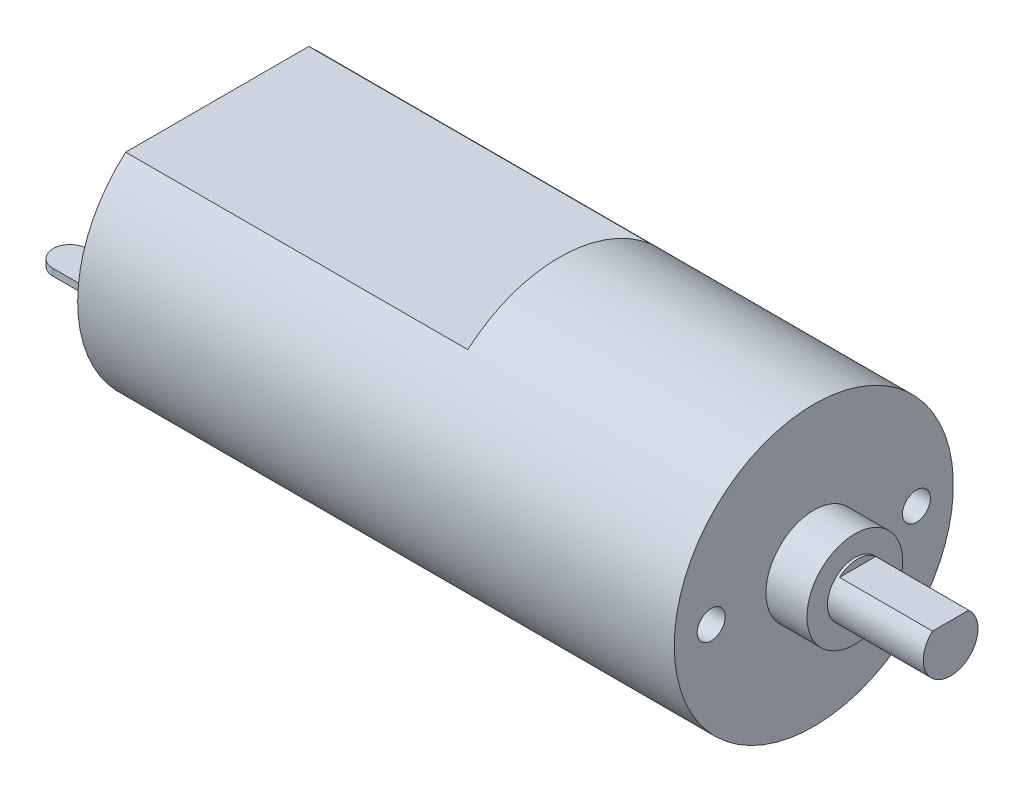
ISO-10303-21;
HEADER;
FILE_DESCRIPTION(('STEP AP214'),'2;1');
FILE_NAME('part.step','',(''),(''),'','','');
FILE_SCHEMA(('AUTOMOTIVE_DESIGN { 1 0 10303 214 1 1 1 1 }'));
ENDSEC;
DATA;
#1=APPLICATION_CONTEXT('core data for automotive mechanical design processes');
#2=APPLICATION_PROTOCOL_DEFINITION('international standard','automotive_design',2000,#1);
#3=PRODUCT_CONTEXT('',#1,'mechanical');
#4=PRODUCT('Part','Part','',(#3));
#5=PRODUCT_RELATED_PRODUCT_CATEGORY('part','',(#4));
#6=PRODUCT_DEFINITION_FORMATION('','',#4);
#7=PRODUCT_DEFINITION_CONTEXT('part definition',#1,'design');
#8=PRODUCT_DEFINITION('design','',#6,#7);
#9=PRODUCT_DEFINITION_SHAPE('','',#8);
#10=(LENGTH_UNIT() NAMED_UNIT(*) SI_UNIT(.MILLI.,.METRE.));
#11=(NAMED_UNIT(*) PLANE_ANGLE_UNIT() SI_UNIT($,.RADIAN.));
#12=(NAMED_UNIT(*) SI_UNIT($,.STERADIAN.) SOLID_ANGLE_UNIT());
#13=UNCERTAINTY_MEASURE_WITH_UNIT(LENGTH_MEASURE(1.E-05),#10,'distance_accuracy_value','');
#14=(GEOMETRIC_REPRESENTATION_CONTEXT(3) GLOBAL_UNCERTAINTY_ASSIGNED_CONTEXT((#13)) GLOBAL_UNIT_ASSIGNED_CONTEXT((#10,
#11,#12)) REPRESENTATION_CONTEXT('',''));
#15=CARTESIAN_POINT('',(0.,0.,0.));
#16=DIRECTION('',(0.,0.,1.));
#17=DIRECTION('',(1.,0.,0.));
#18=AXIS2_PLACEMENT_3D('',#15,#16,#17);
#19=CARTESIAN_POINT('',(-26.8,10.2,0.));
#20=DIRECTION('',(1.,0.,0.));
#21=DIRECTION('',(0.,0.,-1.));
#22=AXIS2_PLACEMENT_3D('',#19,#20,#21);
#23=PLANE('',#22);
#24=CARTESIAN_POINT('',(-26.8,0.,0.));
#25=DIRECTION('',(1.,0.,0.));
#26=DIRECTION('',(0.,0.,-1.));
#27=AXIS2_PLACEMENT_3D('',#24,#25,#26);
#28=CIRCLE('',#27,3.);
#29=CARTESIAN_POINT('',(-26.8,0.,-3.));
#30=VERTEX_POINT('',#29);
#31=EDGE_CURVE('E11',#30,#30,#28,.F.);
#32=ORIENTED_EDGE('',*,*,#31,.F.);
#33=EDGE_LOOP('',(#32));
#34=FACE_BOUND('',#33,.T.);
#35=CARTESIAN_POINT('',(-26.8,0.,0.));
#36=DIRECTION('',(-1.,0.,0.));
#37=DIRECTION('',(0.,0.,1.));
#38=AXIS2_PLACEMENT_3D('',#35,#36,#37);
#39=CIRCLE('',#38,10.2);
#40=CARTESIAN_POINT('',(-26.8,-7.7,6.68954408012981));
#41=VERTEX_POINT('',#40);
#42=CARTESIAN_POINT('',(-26.8,7.7,6.68954408012982));
#43=VERTEX_POINT('',#42);
#44=EDGE_CURVE('E290',#41,#43,#39,.T.);
#45=ORIENTED_EDGE('',*,*,#44,.T.);
#46=DIRECTION('',(0.,0.,1.));
#47=VECTOR('',#46,1.);
#48=CARTESIAN_POINT('',(-26.8,7.7,-6.68954408012982));
#49=LINE('',#48,#47);
#50=CARTESIAN_POINT('',(-26.8,7.7,-6.68954408012982));
#51=VERTEX_POINT('',#50);
#52=EDGE_CURVE('E247',#51,#43,#49,.T.);
#53=ORIENTED_EDGE('',*,*,#52,.F.);
#54=CARTESIAN_POINT('',(-26.8,-7.7,-6.68954408012982));
#55=VERTEX_POINT('',#54);
#56=EDGE_CURVE('E296',#51,#55,#39,.T.);
#57=ORIENTED_EDGE('',*,*,#56,.T.);
#58=DIRECTION('',(0.,0.,-1.));
#59=VECTOR('',#58,1.);
#60=CARTESIAN_POINT('',(-26.8,-7.7,-6.68954408012982));
#61=LINE('',#60,#59);
#62=EDGE_CURVE('E242',#41,#55,#61,.T.);
#63=ORIENTED_EDGE('',*,*,#62,.F.);
#64=EDGE_LOOP('',(#45,#53,#57,#63));
#65=FACE_BOUND('',#64,.T.);
#66=DIRECTION('',(0.,-1.,0.));
#67=VECTOR('',#66,1.);
#68=CARTESIAN_POINT('',(-26.8,0.25,-9.25));
#69=LINE('',#68,#67);
#70=CARTESIAN_POINT('',(-26.8,0.25,-9.25));
#71=VERTEX_POINT('',#70);
#72=CARTESIAN_POINT('',(-26.8,-0.25,-9.25));
#73=VERTEX_POINT('',#72);
#74=EDGE_CURVE('E69',#71,#73,#69,.T.);
#75=ORIENTED_EDGE('',*,*,#74,.F.);
#76=DIRECTION('',(0.,0.,-1.));
#77=VECTOR('',#76,1.);
#78=CARTESIAN_POINT('',(-26.8,0.25,-6.75));
#79=LINE('',#78,#77);
#80=CARTESIAN_POINT('',(-26.8,0.25,-6.75));
#81=VERTEX_POINT('',#80);
#82=EDGE_CURVE('E190',#81,#71,#79,.T.);
#83=ORIENTED_EDGE('',*,*,#82,.F.);
#84=DIRECTION('',(0.,-1.,0.));
#85=VECTOR('',#84,1.);
#86=CARTESIAN_POINT('',(-26.8,0.25,-6.75));
#87=LINE('',#86,#85);
#88=CARTESIAN_POINT('',(-26.8,-0.25,-6.75));
#89=VERTEX_POINT('',#88);
#90=EDGE_CURVE('E204',#81,#89,#87,.T.);
#91=ORIENTED_EDGE('',*,*,#90,.T.);
#92=DIRECTION('',(0.,0.,-1.));
#93=VECTOR('',#92,1.);
#94=CARTESIAN_POINT('',(-26.8,-0.25,-6.75));
#95=LINE('',#94,#93);
#96=EDGE_CURVE('E180',#89,#73,#95,.T.);
#97=ORIENTED_EDGE('',*,*,#96,.T.);
#98=EDGE_LOOP('',(#75,#83,#91,#97));
#99=FACE_BOUND('',#98,.T.);
#100=DIRECTION('',(0.,0.,-1.));
#101=VECTOR('',#100,1.);
#102=CARTESIAN_POINT('',(-26.8,0.25,6.75));
#103=LINE('',#102,#101);
#104=CARTESIAN_POINT('',(-26.8,0.25,9.25));
#105=VERTEX_POINT('',#104);
#106=CARTESIAN_POINT('',(-26.8,0.25,6.75));
#107=VERTEX_POINT('',#106);
#108=EDGE_CURVE('E165',#105,#107,#103,.T.);
#109=ORIENTED_EDGE('',*,*,#108,.F.);
#110=DIRECTION('',(0.,-1.,0.));
#111=VECTOR('',#110,1.);
#112=CARTESIAN_POINT('',(-26.8,0.25,9.25));
#113=LINE('',#112,#111);
#114=CARTESIAN_POINT('',(-26.8,-0.25,9.25));
#115=VERTEX_POINT('',#114);
#116=EDGE_CURVE('E161',#105,#115,#113,.T.);
#117=ORIENTED_EDGE('',*,*,#116,.T.);
#118=DIRECTION('',(0.,0.,-1.));
#119=VECTOR('',#118,1.);
#120=CARTESIAN_POINT('',(-26.8,-0.25,6.75));
#121=LINE('',#120,#119);
#122=CARTESIAN_POINT('',(-26.8,-0.25,6.75));
#123=VERTEX_POINT('',#122);
#124=EDGE_CURVE('E603',#115,#123,#121,.T.);
#125=ORIENTED_EDGE('',*,*,#124,.T.);
#126=DIRECTION('',(0.,-1.,0.));
#127=VECTOR('',#126,1.);
#128=CARTESIAN_POINT('',(-26.8,0.25,6.75));
#129=LINE('',#128,#127);
#130=EDGE_CURVE('E186',#107,#123,#129,.T.);
#131=ORIENTED_EDGE('',*,*,#130,.F.);
#132=EDGE_LOOP('',(#109,#117,#125,#131));
#133=FACE_BOUND('',#132,.T.);
#134=ADVANCED_FACE('F45',(#34,#65,#99,#133),#23,.F.);
#135=CARTESIAN_POINT('',(26.8,0.,0.));
#136=DIRECTION('',(-1.,0.,0.));
#137=DIRECTION('',(0.,0.,1.));
#138=AXIS2_PLACEMENT_3D('',#135,#136,#137);
#139=PLANE('',#138);
#140=CARTESIAN_POINT('',(26.8,0.,0.));
#141=DIRECTION('',(-1.,0.,0.));
#142=DIRECTION('',(0.,0.,1.));
#143=AXIS2_PLACEMENT_3D('',#140,#141,#142);
#144=CIRCLE('',#143,2.);
#145=CARTESIAN_POINT('',(26.8,1.5,-1.32287565553229));
#146=VERTEX_POINT('',#145);
#147=CARTESIAN_POINT('',(26.8,1.5,1.32287565553229));
#148=VERTEX_POINT('',#147);
#149=EDGE_CURVE('E54',#146,#148,#144,.T.);
#150=ORIENTED_EDGE('',*,*,#149,.F.);
#151=DIRECTION('',(0.,0.,-1.));
#152=VECTOR('',#151,1.);
#153=CARTESIAN_POINT('',(26.8,1.5,1.32287565553229));
#154=LINE('',#153,#152);
#155=EDGE_CURVE('E259',#148,#146,#154,.T.);
#156=ORIENTED_EDGE('',*,*,#155,.F.);
#157=EDGE_LOOP('',(#150,#156));
#158=FACE_BOUND('',#157,.T.);
#159=ADVANCED_FACE('F47',(#158),#139,.F.);
#160=CARTESIAN_POINT('',(-26.8,0.,0.));
#161=DIRECTION('',(-1.,0.,0.));
#162=DIRECTION('',(0.,0.,1.));
#163=AXIS2_PLACEMENT_3D('',#160,#161,#162);
#164=CYLINDRICAL_SURFACE('',#163,2.);
#165=ORIENTED_EDGE('',*,*,#149,.T.);
#166=DIRECTION('',(1.,0.,0.));
#167=VECTOR('',#166,1.);
#168=CARTESIAN_POINT('',(20.,1.5,1.32287565553229));
#169=LINE('',#168,#167);
#170=CARTESIAN_POINT('',(20.,1.5,1.32287565553229));
#171=VERTEX_POINT('',#170);
#172=EDGE_CURVE('E283',#171,#148,#169,.T.);
#173=ORIENTED_EDGE('',*,*,#172,.F.);
#174=CARTESIAN_POINT('',(20.,0.,0.));
#175=DIRECTION('',(1.,0.,0.));
#176=DIRECTION('',(0.,0.,-1.));
#177=AXIS2_PLACEMENT_3D('',#174,#175,#176);
#178=CIRCLE('',#177,2.);
#179=CARTESIAN_POINT('',(20.,1.5,-1.32287565553229));
#180=VERTEX_POINT('',#179);
#181=EDGE_CURVE('E277',#180,#171,#178,.T.);
#182=ORIENTED_EDGE('',*,*,#181,.F.);
#183=DIRECTION('',(1.,0.,0.));
#184=VECTOR('',#183,1.);
#185=CARTESIAN_POINT('',(20.,1.5,-1.32287565553229));
#186=LINE('',#185,#184);
#187=EDGE_CURVE('E286',#180,#146,#186,.T.);
#188=ORIENTED_EDGE('',*,*,#187,.T.);
#189=EDGE_LOOP('',(#165,#173,#182,#188));
#190=FACE_BOUND('',#189,.T.);
#191=CARTESIAN_POINT('',(19.8,0.,0.));
#192=DIRECTION('',(-1.,0.,0.));
#193=DIRECTION('',(0.,0.,1.));
#194=AXIS2_PLACEMENT_3D('',#191,#192,#193);
#195=CIRCLE('',#194,2.);
#196=CARTESIAN_POINT('',(19.8,0.,2.));
#197=VERTEX_POINT('',#196);
#198=EDGE_CURVE('E309',#197,#197,#195,.T.);
#199=ORIENTED_EDGE('',*,*,#198,.F.);
#200=EDGE_LOOP('',(#199));
#201=FACE_BOUND('',#200,.T.);
#202=ADVANCED_FACE('F317',(#190,#201),#164,.T.);
#203=CARTESIAN_POINT('',(19.8,2.,0.));
#204=DIRECTION('',(-1.,0.,0.));
#205=DIRECTION('',(0.,0.,1.));
#206=AXIS2_PLACEMENT_3D('',#203,#204,#205);
#207=PLANE('',#206);
#208=CARTESIAN_POINT('',(19.8,0.,0.));
#209=DIRECTION('',(-1.,0.,0.));
#210=DIRECTION('',(0.,0.,1.));
#211=AXIS2_PLACEMENT_3D('',#208,#209,#210);
#212=CIRCLE('',#211,3.5);
#213=CARTESIAN_POINT('',(19.8,0.,3.5));
#214=VERTEX_POINT('',#213);
#215=EDGE_CURVE('E305',#214,#214,#212,.T.);
#216=ORIENTED_EDGE('',*,*,#215,.F.);
#217=EDGE_LOOP('',(#216));
#218=FACE_BOUND('',#217,.T.);
#219=ORIENTED_EDGE('',*,*,#198,.T.);
#220=EDGE_LOOP('',(#219));
#221=FACE_BOUND('',#220,.T.);
#222=ADVANCED_FACE('F361',(#218,#221),#207,.F.);
#223=CARTESIAN_POINT('',(-26.8,0.,0.));
#224=DIRECTION('',(-1.,0.,0.));
#225=DIRECTION('',(0.,0.,1.));
#226=AXIS2_PLACEMENT_3D('',#223,#224,#225);
#227=CYLINDRICAL_SURFACE('',#226,3.5);
#228=CARTESIAN_POINT('',(16.8,0.,0.));
#229=DIRECTION('',(-1.,0.,0.));
#230=DIRECTION('',(0.,0.,1.));
#231=AXIS2_PLACEMENT_3D('',#228,#229,#230);
#232=CIRCLE('',#231,3.5);
#233=CARTESIAN_POINT('',(16.8,0.,3.5));
#234=VERTEX_POINT('',#233);
#235=EDGE_CURVE('E301',#234,#234,#232,.T.);
#236=ORIENTED_EDGE('',*,*,#235,.F.);
#237=EDGE_LOOP('',(#236));
#238=FACE_BOUND('',#237,.T.);
#239=ORIENTED_EDGE('',*,*,#215,.T.);
#240=EDGE_LOOP('',(#239));
#241=FACE_BOUND('',#240,.T.);
#242=ADVANCED_FACE('F357',(#238,#241),#227,.T.);
#243=CARTESIAN_POINT('',(16.8,3.5,0.));
#244=DIRECTION('',(-1.,0.,0.));
#245=DIRECTION('',(0.,0.,1.));
#246=AXIS2_PLACEMENT_3D('',#243,#244,#245);
#247=PLANE('',#246);
#248=CARTESIAN_POINT('',(16.8,0.,7.5));
#249=DIRECTION('',(1.,0.,0.));
#250=DIRECTION('',(0.,0.,-1.));
#251=AXIS2_PLACEMENT_3D('',#248,#249,#250);
#252=CIRCLE('',#251,1.02499999999999);
#253=CARTESIAN_POINT('',(16.8,0.,6.47500000000001));
#254=VERTEX_POINT('',#253);
#255=EDGE_CURVE('E226',#254,#254,#252,.T.);
#256=ORIENTED_EDGE('',*,*,#255,.F.);
#257=EDGE_LOOP('',(#256));
#258=FACE_BOUND('',#257,.T.);
#259=CARTESIAN_POINT('',(16.8,0.,-7.5));
#260=DIRECTION('',(1.,0.,0.));
#261=DIRECTION('',(0.,0.,-1.));
#262=AXIS2_PLACEMENT_3D('',#259,#260,#261);
#263=CIRCLE('',#262,1.02499999999999);
#264=CARTESIAN_POINT('',(16.8,0.,-8.52499999999999));
#265=VERTEX_POINT('',#264);
#266=EDGE_CURVE('E234',#265,#265,#263,.T.);
#267=ORIENTED_EDGE('',*,*,#266,.F.);
#268=EDGE_LOOP('',(#267));
#269=FACE_BOUND('',#268,.T.);
#270=CARTESIAN_POINT('',(16.8,0.,0.));
#271=DIRECTION('',(-1.,0.,0.));
#272=DIRECTION('',(0.,0.,1.));
#273=AXIS2_PLACEMENT_3D('',#270,#271,#272);
#274=CIRCLE('',#273,10.2);
#275=CARTESIAN_POINT('',(16.8,0.,10.2));
#276=VERTEX_POINT('',#275);
#277=EDGE_CURVE('E297',#276,#276,#274,.T.);
#278=ORIENTED_EDGE('',*,*,#277,.F.);
#279=EDGE_LOOP('',(#278));
#280=FACE_BOUND('',#279,.T.);
#281=ORIENTED_EDGE('',*,*,#235,.T.);
#282=EDGE_LOOP('',(#281));
#283=FACE_BOUND('',#282,.T.);
#284=ADVANCED_FACE('F353',(#258,#269,#280,#283),#247,.F.);
#285=CARTESIAN_POINT('',(-26.8,0.,0.));
#286=DIRECTION('',(-1.,0.,0.));
#287=DIRECTION('',(0.,0.,1.));
#288=AXIS2_PLACEMENT_3D('',#285,#286,#287);
#289=CYLINDRICAL_SURFACE('',#288,10.2);
#290=CARTESIAN_POINT('',(-1.8,0.,0.));
#291=DIRECTION('',(-1.,0.,0.));
#292=DIRECTION('',(0.,0.,1.));
#293=AXIS2_PLACEMENT_3D('',#290,#291,#292);
#294=CIRCLE('',#293,10.2);
#295=CARTESIAN_POINT('',(-1.8,7.7,6.68954408012982));
#296=VERTEX_POINT('',#295);
#297=CARTESIAN_POINT('',(-1.8,7.7,-6.68954408012982));
#298=VERTEX_POINT('',#297);
#299=EDGE_CURVE('E243',#296,#298,#294,.T.);
#300=ORIENTED_EDGE('',*,*,#299,.F.);
#301=DIRECTION('',(-1.,0.,0.));
#302=VECTOR('',#301,1.);
#303=CARTESIAN_POINT('',(-1.8,7.7,6.68954408012982));
#304=LINE('',#303,#302);
#305=EDGE_CURVE('E255',#296,#43,#304,.T.);
#306=ORIENTED_EDGE('',*,*,#305,.T.);
#307=ORIENTED_EDGE('',*,*,#44,.F.);
#308=DIRECTION('',(-1.,0.,0.));
#309=VECTOR('',#308,1.);
#310=CARTESIAN_POINT('',(-1.8,-7.7,6.68954408012982));
#311=LINE('',#310,#309);
#312=CARTESIAN_POINT('',(-1.8,-7.7,6.68954408012982));
#313=VERTEX_POINT('',#312);
#314=EDGE_CURVE('E269',#313,#41,#311,.T.);
#315=ORIENTED_EDGE('',*,*,#314,.F.);
#316=CARTESIAN_POINT('',(-1.8,0.,0.));
#317=DIRECTION('',(-1.,0.,0.));
#318=DIRECTION('',(0.,0.,1.));
#319=AXIS2_PLACEMENT_3D('',#316,#317,#318);
#320=CIRCLE('',#319,10.2);
#321=CARTESIAN_POINT('',(-1.8,-7.7,-6.68954408012982));
#322=VERTEX_POINT('',#321);
#323=EDGE_CURVE('E262',#322,#313,#320,.T.);
#324=ORIENTED_EDGE('',*,*,#323,.F.);
#325=DIRECTION('',(-1.,0.,0.));
#326=VECTOR('',#325,1.);
#327=CARTESIAN_POINT('',(-1.8,-7.7,-6.68954408012982));
#328=LINE('',#327,#326);
#329=EDGE_CURVE('E254',#322,#55,#328,.T.);
#330=ORIENTED_EDGE('',*,*,#329,.T.);
#331=ORIENTED_EDGE('',*,*,#56,.F.);
#332=DIRECTION('',(-1.,0.,0.));
#333=VECTOR('',#332,1.);
#334=CARTESIAN_POINT('',(-1.8,7.7,-6.68954408012982));
#335=LINE('',#334,#333);
#336=EDGE_CURVE('E251',#298,#51,#335,.T.);
#337=ORIENTED_EDGE('',*,*,#336,.F.);
#338=EDGE_LOOP('',(#300,#306,#307,#315,#324,#330,#331,#337));
#339=FACE_BOUND('',#338,.T.);
#340=ORIENTED_EDGE('',*,*,#277,.T.);
#341=EDGE_LOOP('',(#340));
#342=FACE_BOUND('',#341,.T.);
#343=ADVANCED_FACE('F338',(#339,#342),#289,.T.);
#344=CARTESIAN_POINT('',(20.,1.5,1.32287565553229));
#345=DIRECTION('',(0.,-1.,0.));
#346=DIRECTION('',(0.,0.,-1.));
#347=AXIS2_PLACEMENT_3D('',#344,#345,#346);
#348=PLANE('',#347);
#349=ORIENTED_EDGE('',*,*,#155,.T.);
#350=ORIENTED_EDGE('',*,*,#187,.F.);
#351=DIRECTION('',(0.,0.,-1.));
#352=VECTOR('',#351,1.);
#353=CARTESIAN_POINT('',(20.,1.5,1.32287565553229));
#354=LINE('',#353,#352);
#355=EDGE_CURVE('E280',#171,#180,#354,.T.);
#356=ORIENTED_EDGE('',*,*,#355,.F.);
#357=ORIENTED_EDGE('',*,*,#172,.T.);
#358=EDGE_LOOP('',(#349,#350,#356,#357));
#359=FACE_BOUND('',#358,.T.);
#360=ADVANCED_FACE('F324',(#359),#348,.F.);
#361=CARTESIAN_POINT('',(20.,0.,0.));
#362=DIRECTION('',(1.,0.,0.));
#363=DIRECTION('',(0.,0.,-1.));
#364=AXIS2_PLACEMENT_3D('',#361,#362,#363);
#365=PLANE('',#364);
#366=ORIENTED_EDGE('',*,*,#181,.T.);
#367=ORIENTED_EDGE('',*,*,#355,.T.);
#368=EDGE_LOOP('',(#366,#367));
#369=FACE_BOUND('',#368,.T.);
#370=ADVANCED_FACE('F327',(#369),#365,.T.);
#371=CARTESIAN_POINT('',(-1.8,-7.7,-6.68954408012982));
#372=DIRECTION('',(0.,1.,0.));
#373=DIRECTION('',(0.,0.,1.));
#374=AXIS2_PLACEMENT_3D('',#371,#372,#373);
#375=PLANE('',#374);
#376=ORIENTED_EDGE('',*,*,#62,.T.);
#377=ORIENTED_EDGE('',*,*,#329,.F.);
#378=DIRECTION('',(0.,0.,-1.));
#379=VECTOR('',#378,1.);
#380=CARTESIAN_POINT('',(-1.8,-7.7,-6.68954408012982));
#381=LINE('',#380,#379);
#382=EDGE_CURVE('E265',#313,#322,#381,.T.);
#383=ORIENTED_EDGE('',*,*,#382,.F.);
#384=ORIENTED_EDGE('',*,*,#314,.T.);
#385=EDGE_LOOP('',(#376,#377,#383,#384));
#386=FACE_BOUND('',#385,.T.);
#387=ADVANCED_FACE('F329',(#386),#375,.F.);
#388=CARTESIAN_POINT('',(-1.8,0.,0.));
#389=DIRECTION('',(-1.,0.,0.));
#390=DIRECTION('',(0.,0.,1.));
#391=AXIS2_PLACEMENT_3D('',#388,#389,#390);
#392=PLANE('',#391);
#393=ORIENTED_EDGE('',*,*,#323,.T.);
#394=ORIENTED_EDGE('',*,*,#382,.T.);
#395=EDGE_LOOP('',(#393,#394));
#396=FACE_BOUND('',#395,.T.);
#397=ADVANCED_FACE('F335',(#396),#392,.T.);
#398=CARTESIAN_POINT('',(-1.8,7.7,-6.68954408012982));
#399=DIRECTION('',(0.,-1.,0.));
#400=DIRECTION('',(0.,0.,-1.));
#401=AXIS2_PLACEMENT_3D('',#398,#399,#400);
#402=PLANE('',#401);
#403=ORIENTED_EDGE('',*,*,#52,.T.);
#404=ORIENTED_EDGE('',*,*,#305,.F.);
#405=DIRECTION('',(0.,0.,1.));
#406=VECTOR('',#405,1.);
#407=CARTESIAN_POINT('',(-1.8,7.7,-6.68954408012982));
#408=LINE('',#407,#406);
#409=EDGE_CURVE('E246',#298,#296,#408,.T.);
#410=ORIENTED_EDGE('',*,*,#409,.F.);
#411=ORIENTED_EDGE('',*,*,#336,.T.);
#412=EDGE_LOOP('',(#403,#404,#410,#411));
#413=FACE_BOUND('',#412,.T.);
#414=ADVANCED_FACE('F415',(#413),#402,.F.);
#415=CARTESIAN_POINT('',(-1.8,0.,0.));
#416=DIRECTION('',(-1.,0.,0.));
#417=DIRECTION('',(0.,0.,1.));
#418=AXIS2_PLACEMENT_3D('',#415,#416,#417);
#419=PLANE('',#418);
#420=ORIENTED_EDGE('',*,*,#299,.T.);
#421=ORIENTED_EDGE('',*,*,#409,.T.);
#422=EDGE_LOOP('',(#420,#421));
#423=FACE_BOUND('',#422,.T.);
#424=ADVANCED_FACE('F424',(#423),#419,.T.);
#425=CARTESIAN_POINT('',(10.45,0.,-7.5));
#426=DIRECTION('',(1.,0.,0.));
#427=DIRECTION('',(0.,0.,-1.));
#428=AXIS2_PLACEMENT_3D('',#425,#426,#427);
#429=CONICAL_SURFACE('',#428,1.02499999999999,1.02974425867665);
#430=CARTESIAN_POINT('',(9.83411786549675,0.,-7.5));
#431=VERTEX_POINT('',#430);
#432=VERTEX_LOOP('',#431);
#433=FACE_BOUND('',#432,.T.);
#434=CARTESIAN_POINT('',(10.45,0.,-7.5));
#435=DIRECTION('',(1.,0.,0.));
#436=DIRECTION('',(0.,0.,-1.));
#437=AXIS2_PLACEMENT_3D('',#434,#435,#436);
#438=CIRCLE('',#437,1.02499999999999);
#439=CARTESIAN_POINT('',(10.45,0.,-8.52499999999999));
#440=VERTEX_POINT('',#439);
#441=EDGE_CURVE('E238',#440,#440,#438,.T.);
#442=ORIENTED_EDGE('',*,*,#441,.T.);
#443=EDGE_LOOP('',(#442));
#444=FACE_BOUND('',#443,.T.);
#445=ADVANCED_FACE('F432',(#433,#444),#429,.F.);
#446=CARTESIAN_POINT('',(16.8,0.,-7.5));
#447=DIRECTION('',(1.,0.,0.));
#448=DIRECTION('',(0.,0.,-1.));
#449=AXIS2_PLACEMENT_3D('',#446,#447,#448);
#450=CYLINDRICAL_SURFACE('',#449,1.02499999999999);
#451=ORIENTED_EDGE('',*,*,#441,.F.);
#452=EDGE_LOOP('',(#451));
#453=FACE_BOUND('',#452,.T.);
#454=ORIENTED_EDGE('',*,*,#266,.T.);
#455=EDGE_LOOP('',(#454));
#456=FACE_BOUND('',#455,.T.);
#457=ADVANCED_FACE('F440',(#453,#456),#450,.F.);
#458=CARTESIAN_POINT('',(10.45,0.,7.5));
#459=DIRECTION('',(1.,0.,0.));
#460=DIRECTION('',(0.,0.,-1.));
#461=AXIS2_PLACEMENT_3D('',#458,#459,#460);
#462=CONICAL_SURFACE('',#461,1.02499999999999,1.02974425867665);
#463=CARTESIAN_POINT('',(9.83411786549675,0.,7.5));
#464=VERTEX_POINT('',#463);
#465=VERTEX_LOOP('',#464);
#466=FACE_BOUND('',#465,.T.);
#467=CARTESIAN_POINT('',(10.45,0.,7.5));
#468=DIRECTION('',(1.,0.,0.));
#469=DIRECTION('',(0.,0.,-1.));
#470=AXIS2_PLACEMENT_3D('',#467,#468,#469);
#471=CIRCLE('',#470,1.02499999999999);
#472=CARTESIAN_POINT('',(10.45,0.,6.47500000000001));
#473=VERTEX_POINT('',#472);
#474=EDGE_CURVE('E230',#473,#473,#471,.T.);
#475=ORIENTED_EDGE('',*,*,#474,.T.);
#476=EDGE_LOOP('',(#475));
#477=FACE_BOUND('',#476,.T.);
#478=ADVANCED_FACE('F449',(#466,#477),#462,.F.);
#479=CARTESIAN_POINT('',(16.8,0.,7.5));
#480=DIRECTION('',(1.,0.,0.));
#481=DIRECTION('',(0.,0.,-1.));
#482=AXIS2_PLACEMENT_3D('',#479,#480,#481);
#483=CYLINDRICAL_SURFACE('',#482,1.02499999999999);
#484=ORIENTED_EDGE('',*,*,#474,.F.);
#485=EDGE_LOOP('',(#484));
#486=FACE_BOUND('',#485,.T.);
#487=ORIENTED_EDGE('',*,*,#255,.T.);
#488=EDGE_LOOP('',(#487));
#489=FACE_BOUND('',#488,.T.);
#490=ADVANCED_FACE('F459',(#486,#489),#483,.F.);
#491=CARTESIAN_POINT('',(-26.8,0.25,-9.25));
#492=DIRECTION('',(0.,0.,1.));
#493=DIRECTION('',(1.,0.,0.));
#494=AXIS2_PLACEMENT_3D('',#491,#492,#493);
#495=PLANE('',#494);
#496=DIRECTION('',(-1.,0.,0.));
#497=VECTOR('',#496,1.);
#498=CARTESIAN_POINT('',(-26.8,-0.25,-9.25));
#499=LINE('',#498,#497);
#500=CARTESIAN_POINT('',(-29.55,-0.25,-9.25));
#501=VERTEX_POINT('',#500);
#502=EDGE_CURVE('E184',#73,#501,#499,.T.);
#503=ORIENTED_EDGE('',*,*,#502,.T.);
#504=DIRECTION('',(0.,-1.,0.));
#505=VECTOR('',#504,1.);
#506=CARTESIAN_POINT('',(-29.55,0.25,-9.25));
#507=LINE('',#506,#505);
#508=CARTESIAN_POINT('',(-29.55,0.25,-9.25));
#509=VERTEX_POINT('',#508);
#510=EDGE_CURVE('E220',#509,#501,#507,.T.);
#511=ORIENTED_EDGE('',*,*,#510,.F.);
#512=DIRECTION('',(-1.,0.,0.));
#513=VECTOR('',#512,1.);
#514=CARTESIAN_POINT('',(-26.8,0.25,-9.25));
#515=LINE('',#514,#513);
#516=EDGE_CURVE('E194',#71,#509,#515,.T.);
#517=ORIENTED_EDGE('',*,*,#516,.F.);
#518=ORIENTED_EDGE('',*,*,#74,.T.);
#519=EDGE_LOOP('',(#503,#511,#517,#518));
#520=FACE_BOUND('',#519,.T.);
#521=ADVANCED_FACE('F467',(#520),#495,.F.);
#522=CARTESIAN_POINT('',(-29.55,0.25,-8.));
#523=DIRECTION('',(0.,-1.,0.));
#524=DIRECTION('',(0.,0.,-1.));
#525=AXIS2_PLACEMENT_3D('',#522,#523,#524);
#526=CYLINDRICAL_SURFACE('',#525,1.25);
#527=CARTESIAN_POINT('',(-29.55,-0.25,-8.));
#528=DIRECTION('',(0.,1.,0.));
#529=DIRECTION('',(0.,0.,1.));
#530=AXIS2_PLACEMENT_3D('',#527,#528,#529);
#531=CIRCLE('',#530,1.25);
#532=CARTESIAN_POINT('',(-29.55,-0.25,-6.75));
#533=VERTEX_POINT('',#532);
#534=EDGE_CURVE('E208',#501,#533,#531,.T.);
#535=ORIENTED_EDGE('',*,*,#534,.T.);
#536=DIRECTION('',(0.,-1.,0.));
#537=VECTOR('',#536,1.);
#538=CARTESIAN_POINT('',(-29.55,0.25,-6.75));
#539=LINE('',#538,#537);
#540=CARTESIAN_POINT('',(-29.55,0.25,-6.75));
#541=VERTEX_POINT('',#540);
#542=EDGE_CURVE('E216',#541,#533,#539,.T.);
#543=ORIENTED_EDGE('',*,*,#542,.F.);
#544=CARTESIAN_POINT('',(-29.55,0.25,-8.));
#545=DIRECTION('',(0.,1.,0.));
#546=DIRECTION('',(0.,0.,1.));
#547=AXIS2_PLACEMENT_3D('',#544,#545,#546);
#548=CIRCLE('',#547,1.25);
#549=EDGE_CURVE('E198',#509,#541,#548,.T.);
#550=ORIENTED_EDGE('',*,*,#549,.F.);
#551=ORIENTED_EDGE('',*,*,#510,.T.);
#552=EDGE_LOOP('',(#535,#543,#550,#551));
#553=FACE_BOUND('',#552,.T.);
#554=ADVANCED_FACE('F483',(#553),#526,.T.);
#555=CARTESIAN_POINT('',(-29.55,0.25,-6.75));
#556=DIRECTION('',(0.,0.,-1.));
#557=DIRECTION('',(-1.,0.,0.));
#558=AXIS2_PLACEMENT_3D('',#555,#556,#557);
#559=PLANE('',#558);
#560=DIRECTION('',(1.,0.,0.));
#561=VECTOR('',#560,1.);
#562=CARTESIAN_POINT('',(-29.55,-0.25,-6.75));
#563=LINE('',#562,#561);
#564=EDGE_CURVE('E195',#533,#89,#563,.T.);
#565=ORIENTED_EDGE('',*,*,#564,.T.);
#566=ORIENTED_EDGE('',*,*,#90,.F.);
#567=DIRECTION('',(1.,0.,0.));
#568=VECTOR('',#567,1.);
#569=CARTESIAN_POINT('',(-29.55,0.25,-6.75));
#570=LINE('',#569,#568);
#571=EDGE_CURVE('E201',#541,#81,#570,.T.);
#572=ORIENTED_EDGE('',*,*,#571,.F.);
#573=ORIENTED_EDGE('',*,*,#542,.T.);
#574=EDGE_LOOP('',(#565,#566,#572,#573));
#575=FACE_BOUND('',#574,.T.);
#576=ADVANCED_FACE('F492',(#575),#559,.F.);
#577=CARTESIAN_POINT('',(-29.55,0.25,-8.));
#578=DIRECTION('',(0.,1.,0.));
#579=DIRECTION('',(0.,0.,1.));
#580=AXIS2_PLACEMENT_3D('',#577,#578,#579);
#581=PLANE('',#580);
#582=ORIENTED_EDGE('',*,*,#82,.T.);
#583=ORIENTED_EDGE('',*,*,#516,.T.);
#584=ORIENTED_EDGE('',*,*,#549,.T.);
#585=ORIENTED_EDGE('',*,*,#571,.T.);
#586=EDGE_LOOP('',(#582,#583,#584,#585));
#587=FACE_BOUND('',#586,.T.);
#588=ADVANCED_FACE('F501',(#587),#581,.T.);
#589=CARTESIAN_POINT('',(-29.55,-0.25,-8.));
#590=DIRECTION('',(0.,1.,0.));
#591=DIRECTION('',(0.,0.,1.));
#592=AXIS2_PLACEMENT_3D('',#589,#590,#591);
#593=PLANE('',#592);
#594=ORIENTED_EDGE('',*,*,#96,.F.);
#595=ORIENTED_EDGE('',*,*,#564,.F.);
#596=ORIENTED_EDGE('',*,*,#534,.F.);
#597=ORIENTED_EDGE('',*,*,#502,.F.);
#598=EDGE_LOOP('',(#594,#595,#596,#597));
#599=FACE_BOUND('',#598,.T.);
#600=ADVANCED_FACE('F510',(#599),#593,.F.);
#601=CARTESIAN_POINT('',(-29.55,0.25,8.));
#602=DIRECTION('',(0.,-1.,0.));
#603=DIRECTION('',(0.,0.,-1.));
#604=AXIS2_PLACEMENT_3D('',#601,#602,#603);
#605=CYLINDRICAL_SURFACE('',#604,1.25);
#606=CARTESIAN_POINT('',(-29.55,-0.25,8.));
#607=DIRECTION('',(0.,1.,0.));
#608=DIRECTION('',(0.,0.,-1.));
#609=AXIS2_PLACEMENT_3D('',#606,#607,#608);
#610=CIRCLE('',#609,1.25);
#611=CARTESIAN_POINT('',(-29.55,-0.25,6.75));
#612=VERTEX_POINT('',#611);
#613=CARTESIAN_POINT('',(-29.55,-0.25,9.25));
#614=VERTEX_POINT('',#613);
#615=EDGE_CURVE('E178',#612,#614,#610,.T.);
#616=ORIENTED_EDGE('',*,*,#615,.T.);
#617=DIRECTION('',(0.,-1.,0.));
#618=VECTOR('',#617,1.);
#619=CARTESIAN_POINT('',(-29.55,0.25,9.25));
#620=LINE('',#619,#618);
#621=CARTESIAN_POINT('',(-29.55,0.25,9.25));
#622=VERTEX_POINT('',#621);
#623=EDGE_CURVE('E158',#622,#614,#620,.T.);
#624=ORIENTED_EDGE('',*,*,#623,.F.);
#625=CARTESIAN_POINT('',(-29.55,0.25,8.));
#626=DIRECTION('',(0.,1.,0.));
#627=DIRECTION('',(0.,0.,-1.));
#628=AXIS2_PLACEMENT_3D('',#625,#626,#627);
#629=CIRCLE('',#628,1.25);
#630=CARTESIAN_POINT('',(-29.55,0.25,6.75));
#631=VERTEX_POINT('',#630);
#632=EDGE_CURVE('E166',#631,#622,#629,.T.);
#633=ORIENTED_EDGE('',*,*,#632,.F.);
#634=DIRECTION('',(0.,-1.,0.));
#635=VECTOR('',#634,1.);
#636=CARTESIAN_POINT('',(-29.55,0.25,6.75));
#637=LINE('',#636,#635);
#638=EDGE_CURVE('E599',#631,#612,#637,.T.);
#639=ORIENTED_EDGE('',*,*,#638,.T.);
#640=EDGE_LOOP('',(#616,#624,#633,#639));
#641=FACE_BOUND('',#640,.T.);
#642=ADVANCED_FACE('F177',(#641),#605,.T.);
#643=CARTESIAN_POINT('',(-26.8,0.25,9.25));
#644=DIRECTION('',(0.,0.,-1.));
#645=DIRECTION('',(-1.,0.,0.));
#646=AXIS2_PLACEMENT_3D('',#643,#644,#645);
#647=PLANE('',#646);
#648=DIRECTION('',(1.,0.,0.));
#649=VECTOR('',#648,1.);
#650=CARTESIAN_POINT('',(-26.8,-0.25,9.25));
#651=LINE('',#650,#649);
#652=EDGE_CURVE('E593',#614,#115,#651,.T.);
#653=ORIENTED_EDGE('',*,*,#652,.T.);
#654=ORIENTED_EDGE('',*,*,#116,.F.);
#655=DIRECTION('',(1.,0.,0.));
#656=VECTOR('',#655,1.);
#657=CARTESIAN_POINT('',(-26.8,0.25,9.25));
#658=LINE('',#657,#656);
#659=EDGE_CURVE('E154',#622,#105,#658,.T.);
#660=ORIENTED_EDGE('',*,*,#659,.F.);
#661=ORIENTED_EDGE('',*,*,#623,.T.);
#662=EDGE_LOOP('',(#653,#654,#660,#661));
#663=FACE_BOUND('',#662,.T.);
#664=ADVANCED_FACE('F156',(#663),#647,.F.);
#665=CARTESIAN_POINT('',(-29.55,0.25,6.75));
#666=DIRECTION('',(0.,0.,1.));
#667=DIRECTION('',(1.,0.,0.));
#668=AXIS2_PLACEMENT_3D('',#665,#666,#667);
#669=PLANE('',#668);
#670=DIRECTION('',(-1.,0.,0.));
#671=VECTOR('',#670,1.);
#672=CARTESIAN_POINT('',(-29.55,-0.25,6.75));
#673=LINE('',#672,#671);
#674=EDGE_CURVE('E61',#123,#612,#673,.T.);
#675=ORIENTED_EDGE('',*,*,#674,.T.);
#676=ORIENTED_EDGE('',*,*,#638,.F.);
#677=DIRECTION('',(-1.,0.,0.));
#678=VECTOR('',#677,1.);
#679=CARTESIAN_POINT('',(-29.55,0.25,6.75));
#680=LINE('',#679,#678);
#681=EDGE_CURVE('E171',#107,#631,#680,.T.);
#682=ORIENTED_EDGE('',*,*,#681,.F.);
#683=ORIENTED_EDGE('',*,*,#130,.T.);
#684=EDGE_LOOP('',(#675,#676,#682,#683));
#685=FACE_BOUND('',#684,.T.);
#686=ADVANCED_FACE('F534',(#685),#669,.F.);
#687=CARTESIAN_POINT('',(-29.55,0.25,8.));
#688=DIRECTION('',(0.,-1.,0.));
#689=DIRECTION('',(0.,0.,-1.));
#690=AXIS2_PLACEMENT_3D('',#687,#688,#689);
#691=PLANE('',#690);
#692=ORIENTED_EDGE('',*,*,#632,.T.);
#693=ORIENTED_EDGE('',*,*,#659,.T.);
#694=ORIENTED_EDGE('',*,*,#108,.T.);
#695=ORIENTED_EDGE('',*,*,#681,.T.);
#696=EDGE_LOOP('',(#692,#693,#694,#695));
#697=FACE_BOUND('',#696,.T.);
#698=ADVANCED_FACE('F169',(#697),#691,.F.);
#699=CARTESIAN_POINT('',(-29.55,-0.25,8.));
#700=DIRECTION('',(0.,-1.,0.));
#701=DIRECTION('',(0.,0.,-1.));
#702=AXIS2_PLACEMENT_3D('',#699,#700,#701);
#703=PLANE('',#702);
#704=ORIENTED_EDGE('',*,*,#615,.F.);
#705=ORIENTED_EDGE('',*,*,#674,.F.);
#706=ORIENTED_EDGE('',*,*,#124,.F.);
#707=ORIENTED_EDGE('',*,*,#652,.F.);
#708=EDGE_LOOP('',(#704,#705,#706,#707));
#709=FACE_BOUND('',#708,.T.);
#710=ADVANCED_FACE('F550',(#709),#703,.T.);
#711=CARTESIAN_POINT('',(-28.8,0.,0.));
#712=DIRECTION('',(1.,0.,0.));
#713=DIRECTION('',(0.,0.,-1.));
#714=AXIS2_PLACEMENT_3D('',#711,#712,#713);
#715=CYLINDRICAL_SURFACE('',#714,3.);
#716=CARTESIAN_POINT('',(-28.8,0.,0.));
#717=DIRECTION('',(-1.,0.,0.));
#718=DIRECTION('',(0.,0.,1.));
#719=AXIS2_PLACEMENT_3D('',#716,#717,#718);
#720=CIRCLE('',#719,3.);
#721=CARTESIAN_POINT('',(-28.8,0.,3.));
#722=VERTEX_POINT('',#721);
#723=EDGE_CURVE('E589',#722,#722,#720,.T.);
#724=ORIENTED_EDGE('',*,*,#723,.F.);
#725=EDGE_LOOP('',(#724));
#726=FACE_BOUND('',#725,.T.);
#727=ORIENTED_EDGE('',*,*,#31,.T.);
#728=EDGE_LOOP('',(#727));
#729=FACE_BOUND('',#728,.T.);
#730=ADVANCED_FACE('F557',(#726,#729),#715,.T.);
#731=CARTESIAN_POINT('',(-28.8,0.,0.));
#732=DIRECTION('',(-1.,0.,0.));
#733=DIRECTION('',(0.,0.,1.));
#734=AXIS2_PLACEMENT_3D('',#731,#732,#733);
#735=PLANE('',#734);
#736=ORIENTED_EDGE('',*,*,#723,.T.);
#737=EDGE_LOOP('',(#736));
#738=FACE_BOUND('',#737,.T.);
#739=ADVANCED_FACE('F564',(#738),#735,.T.);
#740=CLOSED_SHELL('',(#134,#159,#202,#222,#242,#284,#343,#360,#370,#387,#397,#414,#424,#445,
#457,#478,#490,#521,#554,#576,#588,#600,#642,#664,#686,#698,#710,#730,#739));
#741=MANIFOLD_SOLID_BREP('B2',#740);
#742=ADVANCED_BREP_SHAPE_REPRESENTATION('',(#18,#741),#14);
#743=SHAPE_DEFINITION_REPRESENTATION(#9,#742);
ENDSEC;
END-ISO-10303-21;
